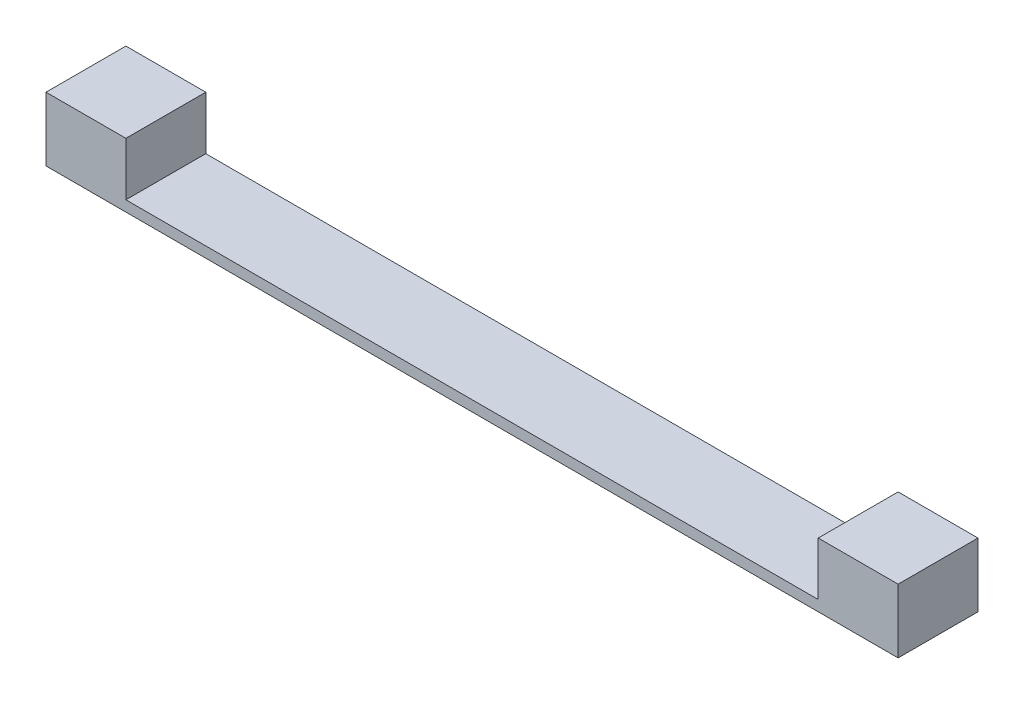
ISO-10303-21;
HEADER;
FILE_DESCRIPTION(('STEP AP214'),'2;1');
FILE_NAME('part.step','',(''),(''),'','','');
FILE_SCHEMA(('AUTOMOTIVE_DESIGN { 1 0 10303 214 1 1 1 1 }'));
ENDSEC;
DATA;
#1=APPLICATION_CONTEXT('core data for automotive mechanical design processes');
#2=APPLICATION_PROTOCOL_DEFINITION('international standard','automotive_design',2000,#1);
#3=PRODUCT_CONTEXT('',#1,'mechanical');
#4=PRODUCT('Part','Part','',(#3));
#5=PRODUCT_RELATED_PRODUCT_CATEGORY('part','',(#4));
#6=PRODUCT_DEFINITION_FORMATION('','',#4);
#7=PRODUCT_DEFINITION_CONTEXT('part definition',#1,'design');
#8=PRODUCT_DEFINITION('design','',#6,#7);
#9=PRODUCT_DEFINITION_SHAPE('','',#8);
#10=(LENGTH_UNIT() NAMED_UNIT(*) SI_UNIT(.MILLI.,.METRE.));
#11=(NAMED_UNIT(*) PLANE_ANGLE_UNIT() SI_UNIT($,.RADIAN.));
#12=(NAMED_UNIT(*) SI_UNIT($,.STERADIAN.) SOLID_ANGLE_UNIT());
#13=UNCERTAINTY_MEASURE_WITH_UNIT(LENGTH_MEASURE(1.E-05),#10,'distance_accuracy_value','');
#14=(GEOMETRIC_REPRESENTATION_CONTEXT(3) GLOBAL_UNCERTAINTY_ASSIGNED_CONTEXT((#13)) GLOBAL_UNIT_ASSIGNED_CONTEXT((#10,
#11,#12)) REPRESENTATION_CONTEXT('',''));
#15=CARTESIAN_POINT('',(0.,0.,0.));
#16=DIRECTION('',(0.,0.,1.));
#17=DIRECTION('',(1.,0.,0.));
#18=AXIS2_PLACEMENT_3D('',#15,#16,#17);
#19=CARTESIAN_POINT('',(0.,1.,0.));
#20=DIRECTION('',(0.,1.,0.));
#21=DIRECTION('',(0.,0.,1.));
#22=AXIS2_PLACEMENT_3D('',#19,#20,#21);
#23=PLANE('',#22);
#24=DIRECTION('',(1.,0.,0.));
#25=VECTOR('',#24,1.);
#26=CARTESIAN_POINT('',(-40.,1.,3.75));
#27=LINE('',#26,#25);
#28=CARTESIAN_POINT('',(-32.5,1.,3.75));
#29=VERTEX_POINT('',#28);
#30=CARTESIAN_POINT('',(32.5,1.,3.75));
#31=VERTEX_POINT('',#30);
#32=EDGE_CURVE('E53',#29,#31,#27,.T.);
#33=ORIENTED_EDGE('',*,*,#32,.T.);
#34=DIRECTION('',(0.,0.,1.));
#35=VECTOR('',#34,1.);
#36=CARTESIAN_POINT('',(32.5,1.,-3.75));
#37=LINE('',#36,#35);
#38=CARTESIAN_POINT('',(32.5,1.,-3.75));
#39=VERTEX_POINT('',#38);
#40=EDGE_CURVE('E48',#39,#31,#37,.T.);
#41=ORIENTED_EDGE('',*,*,#40,.F.);
#42=DIRECTION('',(-1.,0.,0.));
#43=VECTOR('',#42,1.);
#44=CARTESIAN_POINT('',(-40.,1.,-3.75));
#45=LINE('',#44,#43);
#46=CARTESIAN_POINT('',(-32.5,1.,-3.75));
#47=VERTEX_POINT('',#46);
#48=EDGE_CURVE('E144',#39,#47,#45,.T.);
#49=ORIENTED_EDGE('',*,*,#48,.T.);
#50=DIRECTION('',(0.,0.,-1.));
#51=VECTOR('',#50,1.);
#52=CARTESIAN_POINT('',(-32.5,1.,-3.75));
#53=LINE('',#52,#51);
#54=EDGE_CURVE('E125',#29,#47,#53,.T.);
#55=ORIENTED_EDGE('',*,*,#54,.F.);
#56=EDGE_LOOP('',(#33,#41,#49,#55));
#57=FACE_BOUND('',#56,.T.);
#58=ADVANCED_FACE('F33',(#57),#23,.T.);
#59=CARTESIAN_POINT('',(40.,1.,-3.75));
#60=DIRECTION('',(-1.,0.,0.));
#61=DIRECTION('',(0.,0.,1.));
#62=AXIS2_PLACEMENT_3D('',#59,#60,#61);
#63=PLANE('',#62);
#64=DIRECTION('',(0.,0.,-1.));
#65=VECTOR('',#64,1.);
#66=CARTESIAN_POINT('',(40.,0.,-3.75));
#67=LINE('',#66,#65);
#68=CARTESIAN_POINT('',(40.,0.,3.75));
#69=VERTEX_POINT('',#68);
#70=CARTESIAN_POINT('',(40.,0.,-3.75));
#71=VERTEX_POINT('',#70);
#72=EDGE_CURVE('E101',#69,#71,#67,.T.);
#73=ORIENTED_EDGE('',*,*,#72,.T.);
#74=DIRECTION('',(0.,-1.,0.));
#75=VECTOR('',#74,1.);
#76=CARTESIAN_POINT('',(40.,1.,-3.75));
#77=LINE('',#76,#75);
#78=CARTESIAN_POINT('',(40.,6.,-3.75));
#79=VERTEX_POINT('',#78);
#80=EDGE_CURVE('E11',#79,#71,#77,.T.);
#81=ORIENTED_EDGE('',*,*,#80,.F.);
#82=DIRECTION('',(0.,0.,-1.));
#83=VECTOR('',#82,1.);
#84=CARTESIAN_POINT('',(40.,6.,-3.75));
#85=LINE('',#84,#83);
#86=CARTESIAN_POINT('',(40.,6.,3.75));
#87=VERTEX_POINT('',#86);
#88=EDGE_CURVE('E99',#87,#79,#85,.T.);
#89=ORIENTED_EDGE('',*,*,#88,.F.);
#90=DIRECTION('',(0.,-1.,0.));
#91=VECTOR('',#90,1.);
#92=CARTESIAN_POINT('',(40.,1.,3.75));
#93=LINE('',#92,#91);
#94=EDGE_CURVE('E148',#87,#69,#93,.T.);
#95=ORIENTED_EDGE('',*,*,#94,.T.);
#96=EDGE_LOOP('',(#73,#81,#89,#95));
#97=FACE_BOUND('',#96,.T.);
#98=ADVANCED_FACE('F35',(#97),#63,.F.);
#99=CARTESIAN_POINT('',(-40.,1.,-3.75));
#100=DIRECTION('',(0.,0.,1.));
#101=DIRECTION('',(1.,0.,0.));
#102=AXIS2_PLACEMENT_3D('',#99,#100,#101);
#103=PLANE('',#102);
#104=DIRECTION('',(-1.,0.,0.));
#105=VECTOR('',#104,1.);
#106=CARTESIAN_POINT('',(-40.,0.,-3.75));
#107=LINE('',#106,#105);
#108=CARTESIAN_POINT('',(-40.,0.,-3.75));
#109=VERTEX_POINT('',#108);
#110=EDGE_CURVE('E150',#71,#109,#107,.T.);
#111=ORIENTED_EDGE('',*,*,#110,.T.);
#112=DIRECTION('',(0.,-1.,0.));
#113=VECTOR('',#112,1.);
#114=CARTESIAN_POINT('',(-40.,1.,-3.75));
#115=LINE('',#114,#113);
#116=CARTESIAN_POINT('',(-40.,6.,-3.75));
#117=VERTEX_POINT('',#116);
#118=EDGE_CURVE('E41',#117,#109,#115,.T.);
#119=ORIENTED_EDGE('',*,*,#118,.F.);
#120=DIRECTION('',(-1.,0.,0.));
#121=VECTOR('',#120,1.);
#122=CARTESIAN_POINT('',(-40.,6.,-3.75));
#123=LINE('',#122,#121);
#124=CARTESIAN_POINT('',(-32.5,6.,-3.75));
#125=VERTEX_POINT('',#124);
#126=EDGE_CURVE('E133',#125,#117,#123,.T.);
#127=ORIENTED_EDGE('',*,*,#126,.F.);
#128=DIRECTION('',(0.,-1.,0.));
#129=VECTOR('',#128,1.);
#130=CARTESIAN_POINT('',(-32.5,6.,-3.75));
#131=LINE('',#130,#129);
#132=EDGE_CURVE('E136',#125,#47,#131,.T.);
#133=ORIENTED_EDGE('',*,*,#132,.T.);
#134=ORIENTED_EDGE('',*,*,#48,.F.);
#135=DIRECTION('',(0.,-1.,0.));
#136=VECTOR('',#135,1.);
#137=CARTESIAN_POINT('',(32.5,6.,-3.75));
#138=LINE('',#137,#136);
#139=CARTESIAN_POINT('',(32.5,6.,-3.75));
#140=VERTEX_POINT('',#139);
#141=EDGE_CURVE('E107',#140,#39,#138,.T.);
#142=ORIENTED_EDGE('',*,*,#141,.F.);
#143=DIRECTION('',(-1.,0.,0.));
#144=VECTOR('',#143,1.);
#145=CARTESIAN_POINT('',(40.,6.,-3.75));
#146=LINE('',#145,#144);
#147=EDGE_CURVE('E104',#79,#140,#146,.T.);
#148=ORIENTED_EDGE('',*,*,#147,.F.);
#149=ORIENTED_EDGE('',*,*,#80,.T.);
#150=EDGE_LOOP('',(#111,#119,#127,#133,#134,#142,#148,#149));
#151=FACE_BOUND('',#150,.T.);
#152=ADVANCED_FACE('F105',(#151),#103,.F.);
#153=CARTESIAN_POINT('',(-40.,1.,-3.75));
#154=DIRECTION('',(1.,0.,0.));
#155=DIRECTION('',(0.,0.,-1.));
#156=AXIS2_PLACEMENT_3D('',#153,#154,#155);
#157=PLANE('',#156);
#158=DIRECTION('',(0.,0.,1.));
#159=VECTOR('',#158,1.);
#160=CARTESIAN_POINT('',(-40.,0.,-3.75));
#161=LINE('',#160,#159);
#162=CARTESIAN_POINT('',(-40.,0.,3.75));
#163=VERTEX_POINT('',#162);
#164=EDGE_CURVE('E152',#109,#163,#161,.T.);
#165=ORIENTED_EDGE('',*,*,#164,.T.);
#166=DIRECTION('',(0.,-1.,0.));
#167=VECTOR('',#166,1.);
#168=CARTESIAN_POINT('',(-40.,1.,3.75));
#169=LINE('',#168,#167);
#170=CARTESIAN_POINT('',(-40.,6.,3.75));
#171=VERTEX_POINT('',#170);
#172=EDGE_CURVE('E156',#171,#163,#169,.T.);
#173=ORIENTED_EDGE('',*,*,#172,.F.);
#174=DIRECTION('',(0.,0.,1.));
#175=VECTOR('',#174,1.);
#176=CARTESIAN_POINT('',(-40.,6.,-3.75));
#177=LINE('',#176,#175);
#178=EDGE_CURVE('E126',#117,#171,#177,.T.);
#179=ORIENTED_EDGE('',*,*,#178,.F.);
#180=ORIENTED_EDGE('',*,*,#118,.T.);
#181=EDGE_LOOP('',(#165,#173,#179,#180));
#182=FACE_BOUND('',#181,.T.);
#183=ADVANCED_FACE('F162',(#182),#157,.F.);
#184=CARTESIAN_POINT('',(-40.,1.,3.75));
#185=DIRECTION('',(0.,0.,-1.));
#186=DIRECTION('',(-1.,0.,0.));
#187=AXIS2_PLACEMENT_3D('',#184,#185,#186);
#188=PLANE('',#187);
#189=DIRECTION('',(1.,0.,0.));
#190=VECTOR('',#189,1.);
#191=CARTESIAN_POINT('',(-40.,0.,3.75));
#192=LINE('',#191,#190);
#193=EDGE_CURVE('E146',#163,#69,#192,.T.);
#194=ORIENTED_EDGE('',*,*,#193,.T.);
#195=ORIENTED_EDGE('',*,*,#94,.F.);
#196=DIRECTION('',(1.,0.,0.));
#197=VECTOR('',#196,1.);
#198=CARTESIAN_POINT('',(40.,6.,3.75));
#199=LINE('',#198,#197);
#200=CARTESIAN_POINT('',(32.5,6.,3.75));
#201=VERTEX_POINT('',#200);
#202=EDGE_CURVE('E115',#201,#87,#199,.T.);
#203=ORIENTED_EDGE('',*,*,#202,.F.);
#204=DIRECTION('',(0.,-1.,0.));
#205=VECTOR('',#204,1.);
#206=CARTESIAN_POINT('',(32.5,6.,3.75));
#207=LINE('',#206,#205);
#208=EDGE_CURVE('E120',#201,#31,#207,.T.);
#209=ORIENTED_EDGE('',*,*,#208,.T.);
#210=ORIENTED_EDGE('',*,*,#32,.F.);
#211=DIRECTION('',(0.,-1.,0.));
#212=VECTOR('',#211,1.);
#213=CARTESIAN_POINT('',(-32.5,6.,3.75));
#214=LINE('',#213,#212);
#215=CARTESIAN_POINT('',(-32.5,6.,3.75));
#216=VERTEX_POINT('',#215);
#217=EDGE_CURVE('E141',#216,#29,#214,.T.);
#218=ORIENTED_EDGE('',*,*,#217,.F.);
#219=DIRECTION('',(1.,0.,0.));
#220=VECTOR('',#219,1.);
#221=CARTESIAN_POINT('',(-40.,6.,3.75));
#222=LINE('',#221,#220);
#223=EDGE_CURVE('E129',#171,#216,#222,.T.);
#224=ORIENTED_EDGE('',*,*,#223,.F.);
#225=ORIENTED_EDGE('',*,*,#172,.T.);
#226=EDGE_LOOP('',(#194,#195,#203,#209,#210,#218,#224,#225));
#227=FACE_BOUND('',#226,.T.);
#228=ADVANCED_FACE('F168',(#227),#188,.F.);
#229=CARTESIAN_POINT('',(0.,0.,0.));
#230=DIRECTION('',(0.,1.,0.));
#231=DIRECTION('',(0.,0.,1.));
#232=AXIS2_PLACEMENT_3D('',#229,#230,#231);
#233=PLANE('',#232);
#234=ORIENTED_EDGE('',*,*,#72,.F.);
#235=ORIENTED_EDGE('',*,*,#193,.F.);
#236=ORIENTED_EDGE('',*,*,#164,.F.);
#237=ORIENTED_EDGE('',*,*,#110,.F.);
#238=EDGE_LOOP('',(#234,#235,#236,#237));
#239=FACE_BOUND('',#238,.T.);
#240=ADVANCED_FACE('F166',(#239),#233,.F.);
#241=CARTESIAN_POINT('',(-32.5,6.,-3.75));
#242=DIRECTION('',(-1.,0.,0.));
#243=DIRECTION('',(0.,0.,1.));
#244=AXIS2_PLACEMENT_3D('',#241,#242,#243);
#245=PLANE('',#244);
#246=ORIENTED_EDGE('',*,*,#54,.T.);
#247=ORIENTED_EDGE('',*,*,#132,.F.);
#248=DIRECTION('',(0.,0.,-1.));
#249=VECTOR('',#248,1.);
#250=CARTESIAN_POINT('',(-32.5,6.,-3.75));
#251=LINE('',#250,#249);
#252=EDGE_CURVE('E131',#216,#125,#251,.T.);
#253=ORIENTED_EDGE('',*,*,#252,.F.);
#254=ORIENTED_EDGE('',*,*,#217,.T.);
#255=EDGE_LOOP('',(#246,#247,#253,#254));
#256=FACE_BOUND('',#255,.T.);
#257=ADVANCED_FACE('F176',(#256),#245,.F.);
#258=CARTESIAN_POINT('',(0.,6.,0.));
#259=DIRECTION('',(0.,1.,0.));
#260=DIRECTION('',(0.,0.,1.));
#261=AXIS2_PLACEMENT_3D('',#258,#259,#260);
#262=PLANE('',#261);
#263=ORIENTED_EDGE('',*,*,#178,.T.);
#264=ORIENTED_EDGE('',*,*,#223,.T.);
#265=ORIENTED_EDGE('',*,*,#252,.T.);
#266=ORIENTED_EDGE('',*,*,#126,.T.);
#267=EDGE_LOOP('',(#263,#264,#265,#266));
#268=FACE_BOUND('',#267,.T.);
#269=ADVANCED_FACE('F173',(#268),#262,.T.);
#270=CARTESIAN_POINT('',(32.5,6.,-3.75));
#271=DIRECTION('',(1.,0.,0.));
#272=DIRECTION('',(0.,0.,-1.));
#273=AXIS2_PLACEMENT_3D('',#270,#271,#272);
#274=PLANE('',#273);
#275=ORIENTED_EDGE('',*,*,#40,.T.);
#276=ORIENTED_EDGE('',*,*,#208,.F.);
#277=DIRECTION('',(0.,0.,1.));
#278=VECTOR('',#277,1.);
#279=CARTESIAN_POINT('',(32.5,6.,-3.75));
#280=LINE('',#279,#278);
#281=EDGE_CURVE('E110',#140,#201,#280,.T.);
#282=ORIENTED_EDGE('',*,*,#281,.F.);
#283=ORIENTED_EDGE('',*,*,#141,.T.);
#284=EDGE_LOOP('',(#275,#276,#282,#283));
#285=FACE_BOUND('',#284,.T.);
#286=ADVANCED_FACE('F179',(#285),#274,.F.);
#287=CARTESIAN_POINT('',(0.,6.,0.));
#288=DIRECTION('',(0.,-1.,0.));
#289=DIRECTION('',(0.,0.,-1.));
#290=AXIS2_PLACEMENT_3D('',#287,#288,#289);
#291=PLANE('',#290);
#292=ORIENTED_EDGE('',*,*,#88,.T.);
#293=ORIENTED_EDGE('',*,*,#147,.T.);
#294=ORIENTED_EDGE('',*,*,#281,.T.);
#295=ORIENTED_EDGE('',*,*,#202,.T.);
#296=EDGE_LOOP('',(#292,#293,#294,#295));
#297=FACE_BOUND('',#296,.T.);
#298=ADVANCED_FACE('F113',(#297),#291,.F.);
#299=CLOSED_SHELL('',(#58,#98,#152,#183,#228,#240,#257,#269,#286,#298));
#300=MANIFOLD_SOLID_BREP('B2',#299);
#301=ADVANCED_BREP_SHAPE_REPRESENTATION('',(#18,#300),#14);
#302=SHAPE_DEFINITION_REPRESENTATION(#9,#301);
ENDSEC;
END-ISO-10303-21;
